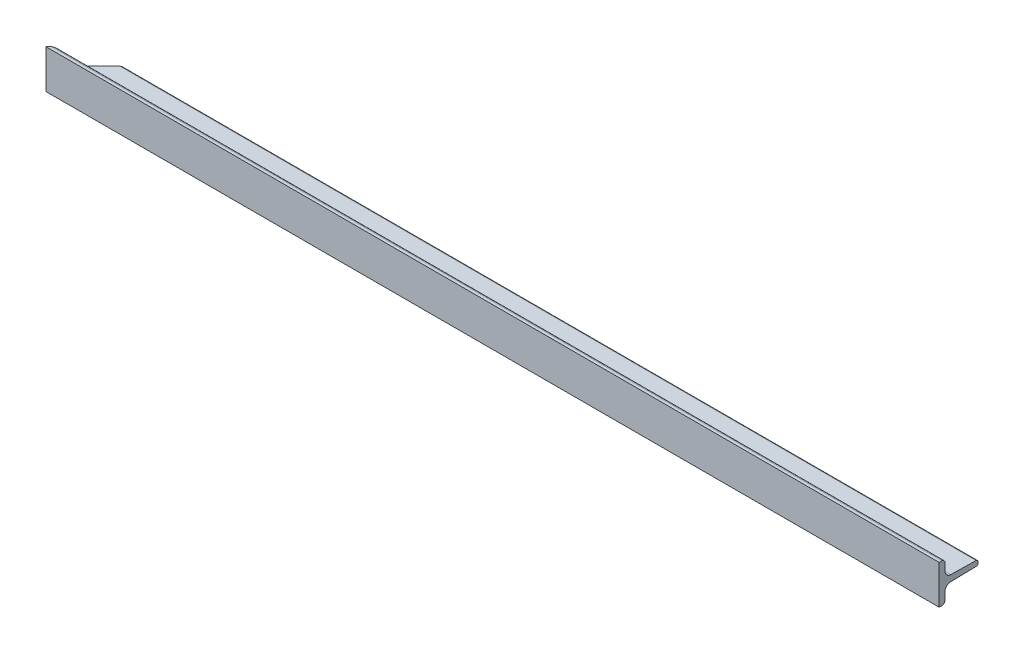
ISO-10303-21;
HEADER;
FILE_DESCRIPTION(('STEP AP214'),'2;1');
FILE_NAME('part.step','',(''),(''),'','','');
FILE_SCHEMA(('AUTOMOTIVE_DESIGN { 1 0 10303 214 1 1 1 1 }'));
ENDSEC;
DATA;
#1=APPLICATION_CONTEXT('core data for automotive mechanical design processes');
#2=APPLICATION_PROTOCOL_DEFINITION('international standard','automotive_design',2000,#1);
#3=PRODUCT_CONTEXT('',#1,'mechanical');
#4=PRODUCT('Part','Part','',(#3));
#5=PRODUCT_RELATED_PRODUCT_CATEGORY('part','',(#4));
#6=PRODUCT_DEFINITION_FORMATION('','',#4);
#7=PRODUCT_DEFINITION_CONTEXT('part definition',#1,'design');
#8=PRODUCT_DEFINITION('design','',#6,#7);
#9=PRODUCT_DEFINITION_SHAPE('','',#8);
#10=(LENGTH_UNIT() NAMED_UNIT(*) SI_UNIT(.MILLI.,.METRE.));
#11=(NAMED_UNIT(*) PLANE_ANGLE_UNIT() SI_UNIT($,.RADIAN.));
#12=(NAMED_UNIT(*) SI_UNIT($,.STERADIAN.) SOLID_ANGLE_UNIT());
#13=UNCERTAINTY_MEASURE_WITH_UNIT(LENGTH_MEASURE(1.E-05),#10,'distance_accuracy_value','');
#14=(GEOMETRIC_REPRESENTATION_CONTEXT(3) GLOBAL_UNCERTAINTY_ASSIGNED_CONTEXT((#13)) GLOBAL_UNIT_ASSIGNED_CONTEXT((#10,
#11,#12)) REPRESENTATION_CONTEXT('',''));
#15=CARTESIAN_POINT('',(0.,0.,0.));
#16=DIRECTION('',(0.,0.,1.));
#17=DIRECTION('',(1.,0.,0.));
#18=AXIS2_PLACEMENT_3D('',#15,#16,#17);
#19=CARTESIAN_POINT('',(460.,-9.99999999999999,20.));
#20=DIRECTION('',(0.,1.,0.));
#21=DIRECTION('',(0.,0.,1.));
#22=AXIS2_PLACEMENT_3D('',#19,#20,#21);
#23=PLANE('',#22);
#24=DIRECTION('',(-1.,0.,0.));
#25=VECTOR('',#24,1.);
#26=CARTESIAN_POINT('',(460.,-9.99999999999999,20.));
#27=LINE('',#26,#25);
#28=CARTESIAN_POINT('',(460.,-9.99999999999999,20.));
#29=VERTEX_POINT('',#28);
#30=CARTESIAN_POINT('',(0.,-9.99999999999999,20.));
#31=VERTEX_POINT('',#30);
#32=EDGE_CURVE('E199',#29,#31,#27,.T.);
#33=ORIENTED_EDGE('',*,*,#32,.T.);
#34=DIRECTION('',(-0.707106781186549,0.,0.707106781186546));
#35=VECTOR('',#34,1.);
#36=CARTESIAN_POINT('',(20.6066017177982,-10.,-0.606601717798156));
#37=LINE('',#36,#35);
#38=CARTESIAN_POINT('',(1.42968541257804,-9.99999999999999,18.570314587422));
#39=VERTEX_POINT('',#38);
#40=EDGE_CURVE('E185',#39,#31,#37,.T.);
#41=ORIENTED_EDGE('',*,*,#40,.F.);
#42=DIRECTION('',(-1.,0.,0.));
#43=VECTOR('',#42,1.);
#44=CARTESIAN_POINT('',(460.,-9.99999999999999,18.570314587422));
#45=LINE('',#44,#43);
#46=CARTESIAN_POINT('',(460.,-9.99999999999999,18.570314587422));
#47=VERTEX_POINT('',#46);
#48=EDGE_CURVE('E13',#47,#39,#45,.T.);
#49=ORIENTED_EDGE('',*,*,#48,.F.);
#50=DIRECTION('',(0.,0.,-1.));
#51=VECTOR('',#50,1.);
#52=CARTESIAN_POINT('',(460.,-9.99999999999999,20.));
#53=LINE('',#52,#51);
#54=EDGE_CURVE('E208',#29,#47,#53,.T.);
#55=ORIENTED_EDGE('',*,*,#54,.F.);
#56=EDGE_LOOP('',(#33,#41,#49,#55));
#57=FACE_BOUND('',#56,.T.);
#58=ADVANCED_FACE('F85',(#57),#23,.F.);
#59=CARTESIAN_POINT('',(460.,-8.49999999999999,18.570314587422));
#60=DIRECTION('',(-1.,0.,0.));
#61=DIRECTION('',(0.,0.,1.));
#62=AXIS2_PLACEMENT_3D('',#59,#60,#61);
#63=CYLINDRICAL_SURFACE('',#62,1.5);
#64=ORIENTED_EDGE('',*,*,#48,.T.);
#65=CARTESIAN_POINT('',(1.42968541257804,-8.49999999999999,18.570314587422));
#66=DIRECTION('',(0.707106781186546,0.,0.707106781186549));
#67=DIRECTION('',(-0.707106781186549,0.,0.707106781186546));
#68=AXIS2_PLACEMENT_3D('',#65,#66,#67);
#69=ELLIPSE('',#68,2.12132034355964,1.5);
#70=CARTESIAN_POINT('',(2.92938537838239,-8.53000020943977,17.0706146216177));
#71=VERTEX_POINT('',#70);
#72=EDGE_CURVE('E182',#39,#71,#69,.T.);
#73=ORIENTED_EDGE('',*,*,#72,.T.);
#74=DIRECTION('',(-1.,0.,0.));
#75=VECTOR('',#74,1.);
#76=CARTESIAN_POINT('',(460.,-8.53000020943977,17.0706146216177));
#77=LINE('',#76,#75);
#78=CARTESIAN_POINT('',(460.,-8.53000020943977,17.0706146216177));
#79=VERTEX_POINT('',#78);
#80=EDGE_CURVE('E94',#79,#71,#77,.T.);
#81=ORIENTED_EDGE('',*,*,#80,.F.);
#82=CARTESIAN_POINT('',(460.,-8.49999999999999,18.570314587422));
#83=DIRECTION('',(1.,0.,0.));
#84=DIRECTION('',(0.,0.,1.));
#85=AXIS2_PLACEMENT_3D('',#82,#83,#84);
#86=CIRCLE('',#85,1.5);
#87=EDGE_CURVE('E204',#47,#79,#86,.T.);
#88=ORIENTED_EDGE('',*,*,#87,.F.);
#89=EDGE_LOOP('',(#64,#73,#81,#88));
#90=FACE_BOUND('',#89,.T.);
#91=ADVANCED_FACE('F203',(#90),#63,.T.);
#92=CARTESIAN_POINT('',(460.,-4.52043643216432,16.9904067428265));
#93=DIRECTION('',(0.,0.020000139626522,0.9997999772029));
#94=DIRECTION('',(0.,-0.9997999772029,0.020000139626522));
#95=AXIS2_PLACEMENT_3D('',#92,#93,#94);
#96=PLANE('',#95);
#97=ORIENTED_EDGE('',*,*,#80,.T.);
#98=DIRECTION('',(0.0199961407423876,0.999600074385162,-0.0199961407423875));
#99=VECTOR('',#98,1.);
#100=CARTESIAN_POINT('',(3.19231888092886,4.61395352092463,16.8076811190712));
#101=LINE('',#100,#99);
#102=CARTESIAN_POINT('',(3.00959325717359,-4.52043643216432,16.9904067428265));
#103=VERTEX_POINT('',#102);
#104=EDGE_CURVE('E188',#71,#103,#101,.T.);
#105=ORIENTED_EDGE('',*,*,#104,.T.);
#106=DIRECTION('',(-1.,0.,0.));
#107=VECTOR('',#106,1.);
#108=CARTESIAN_POINT('',(460.,-4.52043643216432,16.9904067428265));
#109=LINE('',#108,#107);
#110=CARTESIAN_POINT('',(460.,-4.52043643216432,16.9904067428265));
#111=VERTEX_POINT('',#110);
#112=EDGE_CURVE('E293',#111,#103,#109,.T.);
#113=ORIENTED_EDGE('',*,*,#112,.F.);
#114=DIRECTION('',(0.,0.9997999772029,-0.020000139626522));
#115=VECTOR('',#114,1.);
#116=CARTESIAN_POINT('',(460.,-4.52043643216432,16.9904067428265));
#117=LINE('',#116,#115);
#118=EDGE_CURVE('E207',#79,#111,#117,.T.);
#119=ORIENTED_EDGE('',*,*,#118,.F.);
#120=EDGE_LOOP('',(#97,#105,#113,#119));
#121=FACE_BOUND('',#120,.T.);
#122=ADVANCED_FACE('F298',(#121),#96,.F.);
#123=CARTESIAN_POINT('',(460.,-4.58043685104389,13.9910068112178));
#124=DIRECTION('',(-1.,0.,0.));
#125=DIRECTION('',(0.,0.,1.));
#126=AXIS2_PLACEMENT_3D('',#123,#124,#125);
#127=CYLINDRICAL_SURFACE('',#126,3.);
#128=ORIENTED_EDGE('',*,*,#112,.T.);
#129=CARTESIAN_POINT('',(6.00899318878229,-4.58043685104389,13.9910068112178));
#130=DIRECTION('',(0.707106781186546,0.,0.707106781186549));
#131=DIRECTION('',(-0.707106781186549,0.,0.707106781186546));
#132=AXIS2_PLACEMENT_3D('',#129,#130,#131);
#133=ELLIPSE('',#132,4.2426406871193,3.);
#134=CARTESIAN_POINT('',(5.94899276990268,-1.58103691943519,14.0510072300973));
#135=VERTEX_POINT('',#134);
#136=EDGE_CURVE('E307',#103,#135,#133,.F.);
#137=ORIENTED_EDGE('',*,*,#136,.T.);
#138=DIRECTION('',(-1.,0.,0.));
#139=VECTOR('',#138,1.);
#140=CARTESIAN_POINT('',(460.,-1.58103691943519,14.0510072300973));
#141=LINE('',#140,#139);
#142=CARTESIAN_POINT('',(460.,-1.58103691943519,14.0510072300973));
#143=VERTEX_POINT('',#142);
#144=EDGE_CURVE('E289',#143,#135,#141,.T.);
#145=ORIENTED_EDGE('',*,*,#144,.F.);
#146=CARTESIAN_POINT('',(460.,-4.58043685104389,13.9910068112178));
#147=DIRECTION('',(-1.,0.,0.));
#148=DIRECTION('',(0.,0.,-1.));
#149=AXIS2_PLACEMENT_3D('',#146,#147,#148);
#150=CIRCLE('',#149,3.);
#151=EDGE_CURVE('E219',#111,#143,#150,.T.);
#152=ORIENTED_EDGE('',*,*,#151,.F.);
#153=EDGE_LOOP('',(#128,#137,#145,#152));
#154=FACE_BOUND('',#153,.T.);
#155=ADVANCED_FACE('F306',(#154),#127,.F.);
#156=CARTESIAN_POINT('',(460.,-1.3195626461658,0.97999986037347));
#157=DIRECTION('',(0.,0.9997999772029,0.0200001396265305));
#158=DIRECTION('',(0.,-0.0200001396265305,0.9997999772029));
#159=AXIS2_PLACEMENT_3D('',#156,#157,#158);
#160=PLANE('',#159);
#161=ORIENTED_EDGE('',*,*,#144,.T.);
#162=DIRECTION('',(0.707036051838357,0.0141436488099541,-0.707036051838355));
#163=VECTOR('',#162,1.);
#164=CARTESIAN_POINT('',(239.46589263249,3.09026805045727,-219.465892632489));
#165=LINE('',#164,#163);
#166=CARTESIAN_POINT('',(19.0200001396266,-1.3195626461658,0.979999860373471));
#167=VERTEX_POINT('',#166);
#168=EDGE_CURVE('E312',#135,#167,#165,.T.);
#169=ORIENTED_EDGE('',*,*,#168,.T.);
#170=DIRECTION('',(-1.,0.,0.));
#171=VECTOR('',#170,1.);
#172=CARTESIAN_POINT('',(460.,-1.3195626461658,0.979999860373471));
#173=LINE('',#172,#171);
#174=CARTESIAN_POINT('',(460.,-1.3195626461658,0.979999860373471));
#175=VERTEX_POINT('',#174);
#176=EDGE_CURVE('E285',#175,#167,#173,.T.);
#177=ORIENTED_EDGE('',*,*,#176,.F.);
#178=DIRECTION('',(0.,0.0200001396265305,-0.9997999772029));
#179=VECTOR('',#178,1.);
#180=CARTESIAN_POINT('',(460.,-1.3195626461658,0.97999986037347));
#181=LINE('',#180,#179);
#182=EDGE_CURVE('E222',#143,#175,#181,.T.);
#183=ORIENTED_EDGE('',*,*,#182,.F.);
#184=EDGE_LOOP('',(#161,#169,#177,#183));
#185=FACE_BOUND('',#184,.T.);
#186=ADVANCED_FACE('F310',(#185),#160,.F.);
#187=CARTESIAN_POINT('',(460.,-0.319762668962899,1.));
#188=DIRECTION('',(-1.,0.,0.));
#189=DIRECTION('',(0.,0.,1.));
#190=AXIS2_PLACEMENT_3D('',#187,#188,#189);
#191=CYLINDRICAL_SURFACE('',#190,1.);
#192=ORIENTED_EDGE('',*,*,#176,.T.);
#193=CARTESIAN_POINT('',(19.0000000000001,-0.319762668962899,1.));
#194=DIRECTION('',(0.707106781186546,0.,0.707106781186549));
#195=DIRECTION('',(-0.707106781186549,0.,0.707106781186546));
#196=AXIS2_PLACEMENT_3D('',#193,#194,#195);
#197=ELLIPSE('',#196,1.4142135623731,1.);
#198=CARTESIAN_POINT('',(20.0000000000001,-0.319762668962899,0.));
#199=VERTEX_POINT('',#198);
#200=EDGE_CURVE('E375',#167,#199,#197,.T.);
#201=ORIENTED_EDGE('',*,*,#200,.T.);
#202=DIRECTION('',(-1.,0.,0.));
#203=VECTOR('',#202,1.);
#204=CARTESIAN_POINT('',(460.,-0.319762668962899,0.));
#205=LINE('',#204,#203);
#206=CARTESIAN_POINT('',(460.,-0.319762668962899,0.));
#207=VERTEX_POINT('',#206);
#208=EDGE_CURVE('E281',#207,#199,#205,.T.);
#209=ORIENTED_EDGE('',*,*,#208,.F.);
#210=CARTESIAN_POINT('',(460.,-0.319762668962899,1.));
#211=DIRECTION('',(1.,0.,0.));
#212=DIRECTION('',(0.,0.,1.));
#213=AXIS2_PLACEMENT_3D('',#210,#211,#212);
#214=CIRCLE('',#213,1.);
#215=EDGE_CURVE('E225',#175,#207,#214,.T.);
#216=ORIENTED_EDGE('',*,*,#215,.F.);
#217=EDGE_LOOP('',(#192,#201,#209,#216));
#218=FACE_BOUND('',#217,.T.);
#219=ADVANCED_FACE('F316',(#218),#191,.T.);
#220=CARTESIAN_POINT('',(460.,-0.319762668962899,0.));
#221=DIRECTION('',(0.,0.,1.));
#222=DIRECTION('',(0.,-1.,0.));
#223=AXIS2_PLACEMENT_3D('',#220,#221,#222);
#224=PLANE('',#223);
#225=ORIENTED_EDGE('',*,*,#208,.T.);
#226=DIRECTION('',(0.,1.,0.));
#227=VECTOR('',#226,1.);
#228=CARTESIAN_POINT('',(20.0000000000001,-0.319762668962953,0.));
#229=LINE('',#228,#227);
#230=CARTESIAN_POINT('',(20.0000000000002,0.319762668962919,0.));
#231=VERTEX_POINT('',#230);
#232=EDGE_CURVE('E324',#199,#231,#229,.T.);
#233=ORIENTED_EDGE('',*,*,#232,.T.);
#234=DIRECTION('',(-1.,0.,0.));
#235=VECTOR('',#234,1.);
#236=CARTESIAN_POINT('',(460.,0.319762668962919,0.));
#237=LINE('',#236,#235);
#238=CARTESIAN_POINT('',(460.,0.319762668962919,0.));
#239=VERTEX_POINT('',#238);
#240=EDGE_CURVE('E277',#239,#231,#237,.T.);
#241=ORIENTED_EDGE('',*,*,#240,.F.);
#242=DIRECTION('',(0.,1.,0.));
#243=VECTOR('',#242,1.);
#244=CARTESIAN_POINT('',(460.,-0.319762668962899,0.));
#245=LINE('',#244,#243);
#246=EDGE_CURVE('E228',#207,#239,#245,.T.);
#247=ORIENTED_EDGE('',*,*,#246,.F.);
#248=EDGE_LOOP('',(#225,#233,#241,#247));
#249=FACE_BOUND('',#248,.T.);
#250=ADVANCED_FACE('F323',(#249),#224,.F.);
#251=CARTESIAN_POINT('',(460.,0.319762668962918,1.));
#252=DIRECTION('',(-1.,0.,0.));
#253=DIRECTION('',(0.,0.,1.));
#254=AXIS2_PLACEMENT_3D('',#251,#252,#253);
#255=CYLINDRICAL_SURFACE('',#254,1.);
#256=ORIENTED_EDGE('',*,*,#240,.T.);
#257=CARTESIAN_POINT('',(19.0000000000001,0.319762668962918,1.));
#258=DIRECTION('',(0.707106781186546,0.,0.707106781186549));
#259=DIRECTION('',(-0.707106781186549,0.,0.707106781186546));
#260=AXIS2_PLACEMENT_3D('',#257,#258,#259);
#261=ELLIPSE('',#260,1.4142135623731,1.);
#262=CARTESIAN_POINT('',(19.0200001396266,1.31956264616582,0.979999860373476));
#263=VERTEX_POINT('',#262);
#264=EDGE_CURVE('E329',#231,#263,#261,.T.);
#265=ORIENTED_EDGE('',*,*,#264,.T.);
#266=DIRECTION('',(-1.,0.,0.));
#267=VECTOR('',#266,1.);
#268=CARTESIAN_POINT('',(460.,1.31956264616582,0.97999986037347));
#269=LINE('',#268,#267);
#270=CARTESIAN_POINT('',(460.,1.31956264616582,0.97999986037347));
#271=VERTEX_POINT('',#270);
#272=EDGE_CURVE('E273',#271,#263,#269,.T.);
#273=ORIENTED_EDGE('',*,*,#272,.F.);
#274=CARTESIAN_POINT('',(460.,0.319762668962918,1.));
#275=DIRECTION('',(1.,0.,0.));
#276=DIRECTION('',(0.,0.,1.));
#277=AXIS2_PLACEMENT_3D('',#274,#275,#276);
#278=CIRCLE('',#277,1.);
#279=EDGE_CURVE('E231',#239,#271,#278,.T.);
#280=ORIENTED_EDGE('',*,*,#279,.F.);
#281=EDGE_LOOP('',(#256,#265,#273,#280));
#282=FACE_BOUND('',#281,.T.);
#283=ADVANCED_FACE('F327',(#282),#255,.T.);
#284=CARTESIAN_POINT('',(460.,1.58103691943522,14.0510072300973));
#285=DIRECTION('',(0.,-0.9997999772029,0.0200001396265308));
#286=DIRECTION('',(0.,-0.0200001396265308,-0.9997999772029));
#287=AXIS2_PLACEMENT_3D('',#284,#285,#286);
#288=PLANE('',#287);
#289=ORIENTED_EDGE('',*,*,#272,.T.);
#290=DIRECTION('',(-0.707036051838357,0.0141436488099543,0.707036051838355));
#291=VECTOR('',#290,1.);
#292=CARTESIAN_POINT('',(232.929081567161,-2.95950476079951,-212.92908156716));
#293=LINE('',#292,#291);
#294=CARTESIAN_POINT('',(5.94899276990268,1.58103691943521,14.0510072300973));
#295=VERTEX_POINT('',#294);
#296=EDGE_CURVE('E368',#263,#295,#293,.T.);
#297=ORIENTED_EDGE('',*,*,#296,.T.);
#298=DIRECTION('',(-1.,0.,0.));
#299=VECTOR('',#298,1.);
#300=CARTESIAN_POINT('',(460.,1.58103691943521,14.0510072300973));
#301=LINE('',#300,#299);
#302=CARTESIAN_POINT('',(460.,1.58103691943521,14.0510072300973));
#303=VERTEX_POINT('',#302);
#304=EDGE_CURVE('E269',#303,#295,#301,.T.);
#305=ORIENTED_EDGE('',*,*,#304,.F.);
#306=DIRECTION('',(0.,0.0200001396265308,0.9997999772029));
#307=VECTOR('',#306,1.);
#308=CARTESIAN_POINT('',(460.,1.58103691943522,14.0510072300973));
#309=LINE('',#308,#307);
#310=EDGE_CURVE('E234',#271,#303,#309,.T.);
#311=ORIENTED_EDGE('',*,*,#310,.F.);
#312=EDGE_LOOP('',(#289,#297,#305,#311));
#313=FACE_BOUND('',#312,.T.);
#314=ADVANCED_FACE('F333',(#313),#288,.F.);
#315=CARTESIAN_POINT('',(460.,4.58043685104392,13.9910068112178));
#316=DIRECTION('',(-1.,0.,0.));
#317=DIRECTION('',(0.,0.,1.));
#318=AXIS2_PLACEMENT_3D('',#315,#316,#317);
#319=CYLINDRICAL_SURFACE('',#318,3.);
#320=ORIENTED_EDGE('',*,*,#304,.T.);
#321=CARTESIAN_POINT('',(6.00899318878229,4.58043685104392,13.9910068112178));
#322=DIRECTION('',(0.707106781186546,0.,0.707106781186549));
#323=DIRECTION('',(-0.707106781186549,0.,0.707106781186546));
#324=AXIS2_PLACEMENT_3D('',#321,#322,#323);
#325=ELLIPSE('',#324,4.2426406871193,3.);
#326=CARTESIAN_POINT('',(3.00959325717361,4.52043643216435,16.9904067428265));
#327=VERTEX_POINT('',#326);
#328=EDGE_CURVE('E341',#295,#327,#325,.F.);
#329=ORIENTED_EDGE('',*,*,#328,.T.);
#330=DIRECTION('',(-1.,0.,0.));
#331=VECTOR('',#330,1.);
#332=CARTESIAN_POINT('',(460.,4.52043643216434,16.9904067428265));
#333=LINE('',#332,#331);
#334=CARTESIAN_POINT('',(460.,4.52043643216434,16.9904067428265));
#335=VERTEX_POINT('',#334);
#336=EDGE_CURVE('E265',#335,#327,#333,.T.);
#337=ORIENTED_EDGE('',*,*,#336,.F.);
#338=CARTESIAN_POINT('',(460.,4.58043685104392,13.9910068112178));
#339=DIRECTION('',(-1.,0.,0.));
#340=DIRECTION('',(0.,0.,-1.));
#341=AXIS2_PLACEMENT_3D('',#338,#339,#340);
#342=CIRCLE('',#341,3.);
#343=EDGE_CURVE('E237',#303,#335,#342,.T.);
#344=ORIENTED_EDGE('',*,*,#343,.F.);
#345=EDGE_LOOP('',(#320,#329,#337,#344));
#346=FACE_BOUND('',#345,.T.);
#347=ADVANCED_FACE('F340',(#346),#319,.F.);
#348=CARTESIAN_POINT('',(460.,8.53000020943979,17.0706146216177));
#349=DIRECTION('',(0.,-0.020000139626522,0.9997999772029));
#350=DIRECTION('',(0.,-0.9997999772029,-0.020000139626522));
#351=AXIS2_PLACEMENT_3D('',#348,#349,#350);
#352=PLANE('',#351);
#353=ORIENTED_EDGE('',*,*,#336,.T.);
#354=DIRECTION('',(-0.0199961407423876,0.999600074385162,0.0199961407423875));
#355=VECTOR('',#354,1.);
#356=CARTESIAN_POINT('',(3.11214307290864,-0.605992950262202,16.8878569270914));
#357=LINE('',#356,#355);
#358=CARTESIAN_POINT('',(2.92938537838239,8.53000020943979,17.0706146216177));
#359=VERTEX_POINT('',#358);
#360=EDGE_CURVE('E346',#327,#359,#357,.T.);
#361=ORIENTED_EDGE('',*,*,#360,.T.);
#362=DIRECTION('',(-1.,0.,0.));
#363=VECTOR('',#362,1.);
#364=CARTESIAN_POINT('',(460.,8.53000020943979,17.0706146216177));
#365=LINE('',#364,#363);
#366=CARTESIAN_POINT('',(460.,8.53000020943979,17.0706146216177));
#367=VERTEX_POINT('',#366);
#368=EDGE_CURVE('E261',#367,#359,#365,.T.);
#369=ORIENTED_EDGE('',*,*,#368,.F.);
#370=DIRECTION('',(0.,0.9997999772029,0.020000139626522));
#371=VECTOR('',#370,1.);
#372=CARTESIAN_POINT('',(460.,8.53000020943979,17.0706146216177));
#373=LINE('',#372,#371);
#374=EDGE_CURVE('E240',#335,#367,#373,.T.);
#375=ORIENTED_EDGE('',*,*,#374,.F.);
#376=EDGE_LOOP('',(#353,#361,#369,#375));
#377=FACE_BOUND('',#376,.T.);
#378=ADVANCED_FACE('F344',(#377),#352,.F.);
#379=CARTESIAN_POINT('',(460.,8.50000000000001,18.570314587422));
#380=DIRECTION('',(-1.,0.,0.));
#381=DIRECTION('',(0.,0.,1.));
#382=AXIS2_PLACEMENT_3D('',#379,#380,#381);
#383=CYLINDRICAL_SURFACE('',#382,1.5);
#384=ORIENTED_EDGE('',*,*,#368,.T.);
#385=CARTESIAN_POINT('',(1.42968541257804,8.50000000000001,18.570314587422));
#386=DIRECTION('',(0.707106781186546,0.,0.707106781186549));
#387=DIRECTION('',(-0.707106781186549,0.,0.707106781186546));
#388=AXIS2_PLACEMENT_3D('',#385,#386,#387);
#389=ELLIPSE('',#388,2.12132034355965,1.5);
#390=CARTESIAN_POINT('',(1.42968541257796,10.,18.570314587422));
#391=VERTEX_POINT('',#390);
#392=EDGE_CURVE('E358',#359,#391,#389,.T.);
#393=ORIENTED_EDGE('',*,*,#392,.T.);
#394=DIRECTION('',(-1.,0.,0.));
#395=VECTOR('',#394,1.);
#396=CARTESIAN_POINT('',(460.,10.,18.570314587422));
#397=LINE('',#396,#395);
#398=CARTESIAN_POINT('',(460.,10.,18.570314587422));
#399=VERTEX_POINT('',#398);
#400=EDGE_CURVE('E257',#399,#391,#397,.T.);
#401=ORIENTED_EDGE('',*,*,#400,.F.);
#402=CARTESIAN_POINT('',(460.,8.50000000000001,18.570314587422));
#403=DIRECTION('',(1.,0.,0.));
#404=DIRECTION('',(0.,0.,-1.));
#405=AXIS2_PLACEMENT_3D('',#402,#403,#404);
#406=CIRCLE('',#405,1.5);
#407=EDGE_CURVE('E243',#367,#399,#406,.T.);
#408=ORIENTED_EDGE('',*,*,#407,.F.);
#409=EDGE_LOOP('',(#384,#393,#401,#408));
#410=FACE_BOUND('',#409,.T.);
#411=ADVANCED_FACE('F350',(#410),#383,.T.);
#412=CARTESIAN_POINT('',(460.,10.,20.));
#413=DIRECTION('',(0.,-1.,0.));
#414=DIRECTION('',(0.,0.,-1.));
#415=AXIS2_PLACEMENT_3D('',#412,#413,#414);
#416=PLANE('',#415);
#417=ORIENTED_EDGE('',*,*,#400,.T.);
#418=DIRECTION('',(0.707106781186549,0.,-0.707106781186546));
#419=VECTOR('',#418,1.);
#420=CARTESIAN_POINT('',(20.6066017177982,10.,-0.606601717798156));
#421=LINE('',#420,#419);
#422=CARTESIAN_POINT('',(0.,10.,20.));
#423=VERTEX_POINT('',#422);
#424=EDGE_CURVE('E201',#423,#391,#421,.T.);
#425=ORIENTED_EDGE('',*,*,#424,.F.);
#426=DIRECTION('',(-1.,0.,0.));
#427=VECTOR('',#426,1.);
#428=CARTESIAN_POINT('',(460.,10.,20.));
#429=LINE('',#428,#427);
#430=CARTESIAN_POINT('',(460.,10.,20.));
#431=VERTEX_POINT('',#430);
#432=EDGE_CURVE('E253',#431,#423,#429,.T.);
#433=ORIENTED_EDGE('',*,*,#432,.F.);
#434=DIRECTION('',(0.,0.,1.));
#435=VECTOR('',#434,1.);
#436=CARTESIAN_POINT('',(460.,10.,20.));
#437=LINE('',#436,#435);
#438=EDGE_CURVE('E246',#399,#431,#437,.T.);
#439=ORIENTED_EDGE('',*,*,#438,.F.);
#440=EDGE_LOOP('',(#417,#425,#433,#439));
#441=FACE_BOUND('',#440,.T.);
#442=ADVANCED_FACE('F355',(#441),#416,.F.);
#443=CARTESIAN_POINT('',(460.,-9.99999999999999,20.));
#444=DIRECTION('',(0.,0.,-1.));
#445=DIRECTION('',(-1.,0.,0.));
#446=AXIS2_PLACEMENT_3D('',#443,#444,#445);
#447=PLANE('',#446);
#448=DIRECTION('',(0.,-1.,0.));
#449=VECTOR('',#448,1.);
#450=CARTESIAN_POINT('',(0.,-9.99999999999999,20.));
#451=LINE('',#450,#449);
#452=EDGE_CURVE('E193',#423,#31,#451,.T.);
#453=ORIENTED_EDGE('',*,*,#452,.T.);
#454=ORIENTED_EDGE('',*,*,#32,.F.);
#455=DIRECTION('',(0.,-1.,0.));
#456=VECTOR('',#455,1.);
#457=CARTESIAN_POINT('',(460.,-9.99999999999999,20.));
#458=LINE('',#457,#456);
#459=EDGE_CURVE('E101',#431,#29,#458,.T.);
#460=ORIENTED_EDGE('',*,*,#459,.F.);
#461=ORIENTED_EDGE('',*,*,#432,.T.);
#462=EDGE_LOOP('',(#453,#454,#460,#461));
#463=FACE_BOUND('',#462,.T.);
#464=ADVANCED_FACE('F357',(#463),#447,.F.);
#465=CARTESIAN_POINT('',(460.,-8.49999999999999,18.570314587422));
#466=DIRECTION('',(-1.,0.,0.));
#467=DIRECTION('',(0.,0.,1.));
#468=AXIS2_PLACEMENT_3D('',#465,#466,#467);
#469=PLANE('',#468);
#470=ORIENTED_EDGE('',*,*,#54,.T.);
#471=ORIENTED_EDGE('',*,*,#87,.T.);
#472=ORIENTED_EDGE('',*,*,#118,.T.);
#473=ORIENTED_EDGE('',*,*,#151,.T.);
#474=ORIENTED_EDGE('',*,*,#182,.T.);
#475=ORIENTED_EDGE('',*,*,#215,.T.);
#476=ORIENTED_EDGE('',*,*,#246,.T.);
#477=ORIENTED_EDGE('',*,*,#279,.T.);
#478=ORIENTED_EDGE('',*,*,#310,.T.);
#479=ORIENTED_EDGE('',*,*,#343,.T.);
#480=ORIENTED_EDGE('',*,*,#374,.T.);
#481=ORIENTED_EDGE('',*,*,#407,.T.);
#482=ORIENTED_EDGE('',*,*,#438,.T.);
#483=ORIENTED_EDGE('',*,*,#459,.T.);
#484=EDGE_LOOP('',(#470,#471,#472,#473,#474,#475,#476,#477,#478,#479,#480,#481,#482,#483));
#485=FACE_BOUND('',#484,.T.);
#486=ADVANCED_FACE('F210',(#485),#469,.F.);
#487=CARTESIAN_POINT('',(10.,0.,10.));
#488=DIRECTION('',(0.707106781186546,0.,0.707106781186549));
#489=DIRECTION('',(0.707106781186549,0.,-0.707106781186546));
#490=AXIS2_PLACEMENT_3D('',#487,#488,#489);
#491=PLANE('',#490);
#492=ORIENTED_EDGE('',*,*,#40,.T.);
#493=ORIENTED_EDGE('',*,*,#452,.F.);
#494=ORIENTED_EDGE('',*,*,#424,.T.);
#495=ORIENTED_EDGE('',*,*,#392,.F.);
#496=ORIENTED_EDGE('',*,*,#360,.F.);
#497=ORIENTED_EDGE('',*,*,#328,.F.);
#498=ORIENTED_EDGE('',*,*,#296,.F.);
#499=ORIENTED_EDGE('',*,*,#264,.F.);
#500=ORIENTED_EDGE('',*,*,#232,.F.);
#501=ORIENTED_EDGE('',*,*,#200,.F.);
#502=ORIENTED_EDGE('',*,*,#168,.F.);
#503=ORIENTED_EDGE('',*,*,#136,.F.);
#504=ORIENTED_EDGE('',*,*,#104,.F.);
#505=ORIENTED_EDGE('',*,*,#72,.F.);
#506=EDGE_LOOP('',(#492,#493,#494,#495,#496,#497,#498,#499,#500,#501,#502,#503,#504,#505));
#507=FACE_BOUND('',#506,.T.);
#508=ADVANCED_FACE('F184',(#507),#491,.F.);
#509=CLOSED_SHELL('',(#58,#91,#122,#155,#186,#219,#250,#283,#314,#347,#378,#411,#442,#464,#486,#508));
#510=MANIFOLD_SOLID_BREP('B2',#509);
#511=ADVANCED_BREP_SHAPE_REPRESENTATION('',(#18,#510),#14);
#512=SHAPE_DEFINITION_REPRESENTATION(#9,#511);
ENDSEC;
END-ISO-10303-21;
